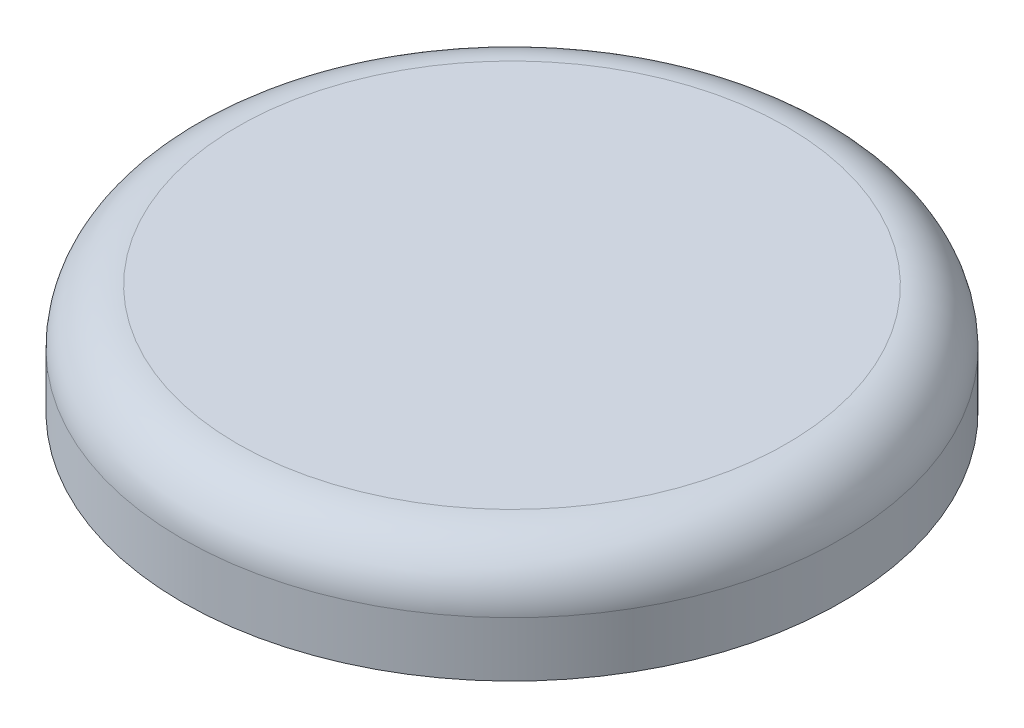
ISO-10303-21;
HEADER;
FILE_DESCRIPTION(('STEP AP214'),'2;1');
FILE_NAME('part.step','',(''),(''),'','','');
FILE_SCHEMA(('AUTOMOTIVE_DESIGN { 1 0 10303 214 1 1 1 1 }'));
ENDSEC;
DATA;
#1=APPLICATION_CONTEXT('core data for automotive mechanical design processes');
#2=APPLICATION_PROTOCOL_DEFINITION('international standard','automotive_design',2000,#1);
#3=PRODUCT_CONTEXT('',#1,'mechanical');
#4=PRODUCT('Part','Part','',(#3));
#5=PRODUCT_RELATED_PRODUCT_CATEGORY('part','',(#4));
#6=PRODUCT_DEFINITION_FORMATION('','',#4);
#7=PRODUCT_DEFINITION_CONTEXT('part definition',#1,'design');
#8=PRODUCT_DEFINITION('design','',#6,#7);
#9=PRODUCT_DEFINITION_SHAPE('','',#8);
#10=(LENGTH_UNIT() NAMED_UNIT(*) SI_UNIT(.MILLI.,.METRE.));
#11=(NAMED_UNIT(*) PLANE_ANGLE_UNIT() SI_UNIT($,.RADIAN.));
#12=(NAMED_UNIT(*) SI_UNIT($,.STERADIAN.) SOLID_ANGLE_UNIT());
#13=UNCERTAINTY_MEASURE_WITH_UNIT(LENGTH_MEASURE(1.E-05),#10,'distance_accuracy_value','');
#14=(GEOMETRIC_REPRESENTATION_CONTEXT(3) GLOBAL_UNCERTAINTY_ASSIGNED_CONTEXT((#13)) GLOBAL_UNIT_ASSIGNED_CONTEXT((#10,
#11,#12)) REPRESENTATION_CONTEXT('',''));
#15=CARTESIAN_POINT('',(0.,0.,0.));
#16=DIRECTION('',(0.,0.,1.));
#17=DIRECTION('',(1.,0.,0.));
#18=AXIS2_PLACEMENT_3D('',#15,#16,#17);
#19=CARTESIAN_POINT('',(0.,20.,0.));
#20=DIRECTION('',(0.,-1.,0.));
#21=DIRECTION('',(0.,0.,-1.));
#22=AXIS2_PLACEMENT_3D('',#19,#20,#21);
#23=CYLINDRICAL_SURFACE('',#22,60.);
#24=CARTESIAN_POINT('',(0.,10.,0.));
#25=DIRECTION('',(0.,1.,0.));
#26=DIRECTION('',(0.,0.,1.));
#27=AXIS2_PLACEMENT_3D('',#24,#25,#26);
#28=CIRCLE('',#27,60.);
#29=CARTESIAN_POINT('',(0.,10.,60.));
#30=VERTEX_POINT('',#29);
#31=EDGE_CURVE('E10',#30,#30,#28,.F.);
#32=ORIENTED_EDGE('',*,*,#31,.T.);
#33=EDGE_LOOP('',(#32));
#34=FACE_BOUND('',#33,.T.);
#35=CARTESIAN_POINT('',(0.,0.,0.));
#36=DIRECTION('',(0.,1.,0.));
#37=DIRECTION('',(0.,0.,1.));
#38=AXIS2_PLACEMENT_3D('',#35,#36,#37);
#39=CIRCLE('',#38,60.);
#40=CARTESIAN_POINT('',(0.,0.,60.));
#41=VERTEX_POINT('',#40);
#42=EDGE_CURVE('E42',#41,#41,#39,.T.);
#43=ORIENTED_EDGE('',*,*,#42,.T.);
#44=EDGE_LOOP('',(#43));
#45=FACE_BOUND('',#44,.T.);
#46=ADVANCED_FACE('F31',(#34,#45),#23,.T.);
#47=CARTESIAN_POINT('',(0.,20.,0.));
#48=DIRECTION('',(0.,1.,0.));
#49=DIRECTION('',(0.,0.,1.));
#50=AXIS2_PLACEMENT_3D('',#47,#48,#49);
#51=PLANE('',#50);
#52=CARTESIAN_POINT('',(0.,20.,0.));
#53=DIRECTION('',(0.,1.,0.));
#54=DIRECTION('',(0.,0.,1.));
#55=AXIS2_PLACEMENT_3D('',#52,#53,#54);
#56=CIRCLE('',#55,50.);
#57=CARTESIAN_POINT('',(0.,20.,50.));
#58=VERTEX_POINT('',#57);
#59=EDGE_CURVE('E38',#58,#58,#56,.T.);
#60=ORIENTED_EDGE('',*,*,#59,.T.);
#61=EDGE_LOOP('',(#60));
#62=FACE_BOUND('',#61,.T.);
#63=ADVANCED_FACE('F52',(#62),#51,.T.);
#64=CARTESIAN_POINT('',(0.,0.,0.));
#65=DIRECTION('',(0.,1.,0.));
#66=DIRECTION('',(0.,0.,1.));
#67=AXIS2_PLACEMENT_3D('',#64,#65,#66);
#68=PLANE('',#67);
#69=ORIENTED_EDGE('',*,*,#42,.F.);
#70=EDGE_LOOP('',(#69));
#71=FACE_BOUND('',#70,.T.);
#72=ADVANCED_FACE('F50',(#71),#68,.F.);
#73=CARTESIAN_POINT('',(0.,10.,0.));
#74=DIRECTION('',(0.,1.,0.));
#75=DIRECTION('',(0.,0.,1.));
#76=AXIS2_PLACEMENT_3D('',#73,#74,#75);
#77=TOROIDAL_SURFACE('',#76,50.,10.);
#78=ORIENTED_EDGE('',*,*,#31,.F.);
#79=EDGE_LOOP('',(#78));
#80=FACE_BOUND('',#79,.T.);
#81=ORIENTED_EDGE('',*,*,#59,.F.);
#82=EDGE_LOOP('',(#81));
#83=FACE_BOUND('',#82,.T.);
#84=ADVANCED_FACE('F33',(#80,#83),#77,.T.);
#85=CLOSED_SHELL('',(#46,#63,#72,#84));
#86=MANIFOLD_SOLID_BREP('B2',#85);
#87=ADVANCED_BREP_SHAPE_REPRESENTATION('',(#18,#86),#14);
#88=SHAPE_DEFINITION_REPRESENTATION(#9,#87);
ENDSEC;
END-ISO-10303-21;
